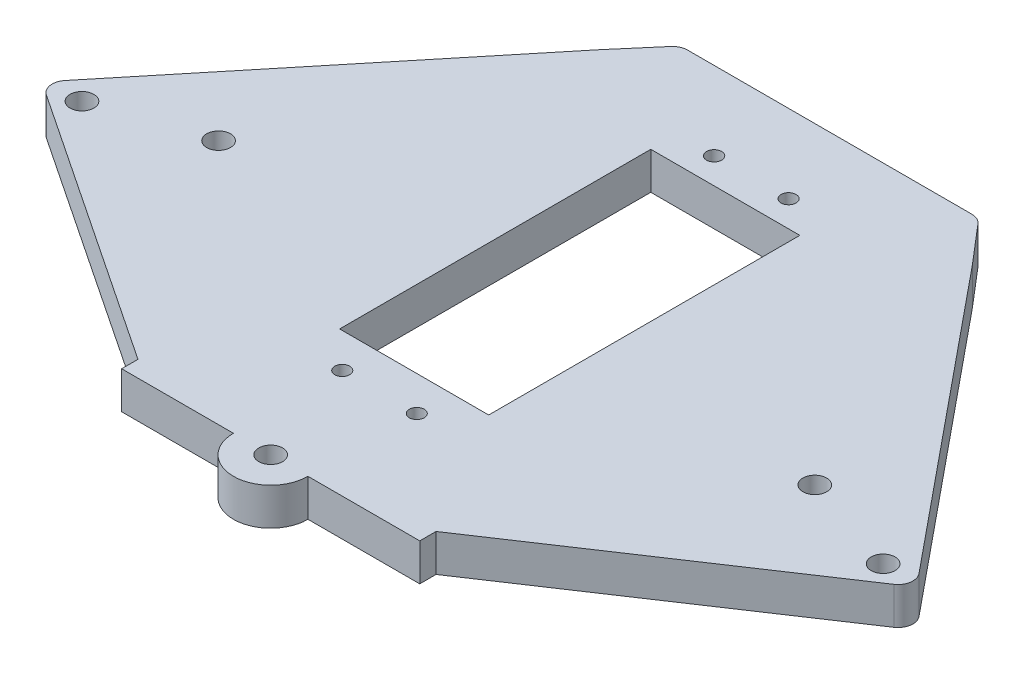
ISO-10303-21;
HEADER;
FILE_DESCRIPTION(('STEP AP214'),'2;1');
FILE_NAME('part.step','',(''),(''),'','','');
FILE_SCHEMA(('AUTOMOTIVE_DESIGN { 1 0 10303 214 1 1 1 1 }'));
ENDSEC;
DATA;
#1=APPLICATION_CONTEXT('core data for automotive mechanical design processes');
#2=APPLICATION_PROTOCOL_DEFINITION('international standard','automotive_design',2000,#1);
#3=PRODUCT_CONTEXT('',#1,'mechanical');
#4=PRODUCT('Part','Part','',(#3));
#5=PRODUCT_RELATED_PRODUCT_CATEGORY('part','',(#4));
#6=PRODUCT_DEFINITION_FORMATION('','',#4);
#7=PRODUCT_DEFINITION_CONTEXT('part definition',#1,'design');
#8=PRODUCT_DEFINITION('design','',#6,#7);
#9=PRODUCT_DEFINITION_SHAPE('','',#8);
#10=(LENGTH_UNIT() NAMED_UNIT(*) SI_UNIT(.MILLI.,.METRE.));
#11=(NAMED_UNIT(*) PLANE_ANGLE_UNIT() SI_UNIT($,.RADIAN.));
#12=(NAMED_UNIT(*) SI_UNIT($,.STERADIAN.) SOLID_ANGLE_UNIT());
#13=UNCERTAINTY_MEASURE_WITH_UNIT(LENGTH_MEASURE(1.E-05),#10,'distance_accuracy_value','');
#14=(GEOMETRIC_REPRESENTATION_CONTEXT(3) GLOBAL_UNCERTAINTY_ASSIGNED_CONTEXT((#13)) GLOBAL_UNIT_ASSIGNED_CONTEXT((#10,
#11,#12)) REPRESENTATION_CONTEXT('',''));
#15=CARTESIAN_POINT('',(0.,0.,0.));
#16=DIRECTION('',(0.,0.,1.));
#17=DIRECTION('',(1.,0.,0.));
#18=AXIS2_PLACEMENT_3D('',#15,#16,#17);
#19=CARTESIAN_POINT('',(20.,0.,10.));
#20=DIRECTION('',(1.,0.,0.));
#21=DIRECTION('',(0.,1.,0.));
#22=AXIS2_PLACEMENT_3D('',#19,#20,#21);
#23=PLANE('',#22);
#24=DIRECTION('',(0.,0.,-1.));
#25=VECTOR('',#24,1.);
#26=CARTESIAN_POINT('',(20.,0.,10.));
#27=LINE('',#26,#25);
#28=CARTESIAN_POINT('',(20.,0.,10.));
#29=VERTEX_POINT('',#28);
#30=CARTESIAN_POINT('',(20.,0.,7.81202776350934));
#31=VERTEX_POINT('',#30);
#32=EDGE_CURVE('E335',#29,#31,#27,.T.);
#33=ORIENTED_EDGE('',*,*,#32,.T.);
#34=DIRECTION('',(0.,1.,0.));
#35=VECTOR('',#34,1.);
#36=CARTESIAN_POINT('',(20.,0.,7.81202776350934));
#37=LINE('',#36,#35);
#38=CARTESIAN_POINT('',(20.,5.,7.81202776350934));
#39=VERTEX_POINT('',#38);
#40=EDGE_CURVE('E11',#31,#39,#37,.T.);
#41=ORIENTED_EDGE('',*,*,#40,.T.);
#42=DIRECTION('',(0.,0.,-1.));
#43=VECTOR('',#42,1.);
#44=CARTESIAN_POINT('',(20.,5.,10.));
#45=LINE('',#44,#43);
#46=CARTESIAN_POINT('',(20.,5.,10.));
#47=VERTEX_POINT('',#46);
#48=EDGE_CURVE('E261',#47,#39,#45,.T.);
#49=ORIENTED_EDGE('',*,*,#48,.F.);
#50=DIRECTION('',(0.,1.,0.));
#51=VECTOR('',#50,1.);
#52=CARTESIAN_POINT('',(20.,0.,10.));
#53=LINE('',#52,#51);
#54=EDGE_CURVE('E314',#29,#47,#53,.T.);
#55=ORIENTED_EDGE('',*,*,#54,.F.);
#56=EDGE_LOOP('',(#33,#41,#49,#55));
#57=FACE_BOUND('',#56,.T.);
#58=ADVANCED_FACE('F40',(#57),#23,.T.);
#59=CARTESIAN_POINT('',(20.,0.,7.81202776350934));
#60=DIRECTION('',(0.554700196225874,0.,0.832050294337414));
#61=DIRECTION('',(0.,-1.,0.));
#62=AXIS2_PLACEMENT_3D('',#59,#60,#61);
#63=PLANE('',#62);
#64=DIRECTION('',(0.832050294337414,0.,-0.554700196225874));
#65=VECTOR('',#64,1.);
#66=CARTESIAN_POINT('',(20.,0.,7.81202776350934));
#67=LINE('',#66,#65);
#68=CARTESIAN_POINT('',(56.8570140036908,0.,-16.759314905659));
#69=VERTEX_POINT('',#68);
#70=EDGE_CURVE('E364',#31,#69,#67,.T.);
#71=ORIENTED_EDGE('',*,*,#70,.T.);
#72=DIRECTION('',(0.,1.,0.));
#73=VECTOR('',#72,1.);
#74=CARTESIAN_POINT('',(56.8570140036908,0.,-16.759314905659));
#75=LINE('',#74,#73);
#76=CARTESIAN_POINT('',(56.8570140036908,5.,-16.759314905659));
#77=VERTEX_POINT('',#76);
#78=EDGE_CURVE('E48',#69,#77,#75,.T.);
#79=ORIENTED_EDGE('',*,*,#78,.T.);
#80=DIRECTION('',(0.832050294337415,0.,-0.554700196225872));
#81=VECTOR('',#80,1.);
#82=CARTESIAN_POINT('',(20.,5.,7.81202776350934));
#83=LINE('',#82,#81);
#84=EDGE_CURVE('E264',#39,#77,#83,.T.);
#85=ORIENTED_EDGE('',*,*,#84,.F.);
#86=ORIENTED_EDGE('',*,*,#40,.F.);
#87=EDGE_LOOP('',(#71,#79,#85,#86));
#88=FACE_BOUND('',#87,.T.);
#89=ADVANCED_FACE('F508',(#88),#63,.T.);
#90=CARTESIAN_POINT('',(55.7476136112391,0.,-18.4234154943338));
#91=DIRECTION('',(0.,1.,0.));
#92=DIRECTION('',(0.55470019622586,0.,0.832050294337423));
#93=AXIS2_PLACEMENT_3D('',#90,#91,#92);
#94=CYLINDRICAL_SURFACE('',#93,2.);
#95=CARTESIAN_POINT('',(55.7476136112391,0.,-18.4234154943338));
#96=DIRECTION('',(0.,1.,0.));
#97=DIRECTION('',(0.55470019622586,0.,0.832050294337423));
#98=AXIS2_PLACEMENT_3D('',#95,#96,#97);
#99=CIRCLE('',#98,2.);
#100=CARTESIAN_POINT('',(57.2953926941983,0.,-19.6900566867613));
#101=VERTEX_POINT('',#100);
#102=EDGE_CURVE('E368',#69,#101,#99,.T.);
#103=ORIENTED_EDGE('',*,*,#102,.T.);
#104=DIRECTION('',(0.,1.,0.));
#105=VECTOR('',#104,1.);
#106=CARTESIAN_POINT('',(57.2953926941983,0.,-19.6900566867613));
#107=LINE('',#106,#105);
#108=CARTESIAN_POINT('',(57.2953926941982,5.,-19.6900566867613));
#109=VERTEX_POINT('',#108);
#110=EDGE_CURVE('E316',#101,#109,#107,.T.);
#111=ORIENTED_EDGE('',*,*,#110,.T.);
#112=CARTESIAN_POINT('',(55.7476136112391,5.,-18.4234154943338));
#113=DIRECTION('',(0.,1.,0.));
#114=DIRECTION('',(0.,0.,1.));
#115=AXIS2_PLACEMENT_3D('',#112,#113,#114);
#116=CIRCLE('',#115,1.99999999999997);
#117=EDGE_CURVE('E267',#77,#109,#116,.T.);
#118=ORIENTED_EDGE('',*,*,#117,.F.);
#119=ORIENTED_EDGE('',*,*,#78,.F.);
#120=EDGE_LOOP('',(#103,#111,#118,#119));
#121=FACE_BOUND('',#120,.T.);
#122=ADVANCED_FACE('F505',(#121),#94,.T.);
#123=CARTESIAN_POINT('',(57.2953926941983,0.,-19.6900566867613));
#124=DIRECTION('',(0.77388954147282,0.,-0.633320596221999));
#125=DIRECTION('',(0.,-1.,0.));
#126=AXIS2_PLACEMENT_3D('',#123,#124,#125);
#127=PLANE('',#126);
#128=DIRECTION('',(-0.633320596221999,0.,-0.77388954147282));
#129=VECTOR('',#128,1.);
#130=CARTESIAN_POINT('',(57.2953926941982,0.,-19.6900566867613));
#131=LINE('',#130,#129);
#132=CARTESIAN_POINT('',(25.0302820040679,0.,-59.1165838935317));
#133=VERTEX_POINT('',#132);
#134=EDGE_CURVE('E362',#101,#133,#131,.T.);
#135=ORIENTED_EDGE('',*,*,#134,.T.);
#136=DIRECTION('',(0.,1.,0.));
#137=VECTOR('',#136,1.);
#138=CARTESIAN_POINT('',(25.0302820040679,0.,-59.1165838935317));
#139=LINE('',#138,#137);
#140=CARTESIAN_POINT('',(25.0302820040679,5.,-59.1165838935317));
#141=VERTEX_POINT('',#140);
#142=EDGE_CURVE('E318',#133,#141,#139,.T.);
#143=ORIENTED_EDGE('',*,*,#142,.T.);
#144=DIRECTION('',(-0.633320596222,0.,-0.773889541472819));
#145=VECTOR('',#144,1.);
#146=CARTESIAN_POINT('',(57.2953926941983,5.,-19.6900566867613));
#147=LINE('',#146,#145);
#148=EDGE_CURVE('E270',#109,#141,#147,.T.);
#149=ORIENTED_EDGE('',*,*,#148,.F.);
#150=ORIENTED_EDGE('',*,*,#110,.F.);
#151=EDGE_LOOP('',(#135,#143,#149,#150));
#152=FACE_BOUND('',#151,.T.);
#153=ADVANCED_FACE('F502',(#152),#127,.T.);
#154=CARTESIAN_POINT('',(25.0302820040679,0.,-59.1165838935317));
#155=DIRECTION('',(0.760063265775029,0.,-0.649849084033669));
#156=DIRECTION('',(0.,-1.,0.));
#157=AXIS2_PLACEMENT_3D('',#154,#155,#156);
#158=PLANE('',#157);
#159=DIRECTION('',(-0.649849084033669,0.,-0.760063265775028));
#160=VECTOR('',#159,1.);
#161=CARTESIAN_POINT('',(25.0302820040679,0.,-59.1165838935317));
#162=LINE('',#161,#160);
#163=CARTESIAN_POINT('',(20.5987534518777,0.,-64.2996981680738));
#164=VERTEX_POINT('',#163);
#165=EDGE_CURVE('E359',#133,#164,#162,.T.);
#166=ORIENTED_EDGE('',*,*,#165,.T.);
#167=DIRECTION('',(0.,1.,0.));
#168=VECTOR('',#167,1.);
#169=CARTESIAN_POINT('',(20.5987534518777,0.,-64.2996981680738));
#170=LINE('',#169,#168);
#171=CARTESIAN_POINT('',(20.5987534518777,5.,-64.2996981680738));
#172=VERTEX_POINT('',#171);
#173=EDGE_CURVE('E356',#164,#172,#170,.T.);
#174=ORIENTED_EDGE('',*,*,#173,.T.);
#175=DIRECTION('',(-0.649849084033664,0.,-0.760063265775033));
#176=VECTOR('',#175,1.);
#177=CARTESIAN_POINT('',(25.0302820040679,5.,-59.1165838935317));
#178=LINE('',#177,#176);
#179=EDGE_CURVE('E273',#141,#172,#178,.T.);
#180=ORIENTED_EDGE('',*,*,#179,.F.);
#181=ORIENTED_EDGE('',*,*,#142,.F.);
#182=EDGE_LOOP('',(#166,#174,#180,#181));
#183=FACE_BOUND('',#182,.T.);
#184=ADVANCED_FACE('F498',(#183),#158,.T.);
#185=CARTESIAN_POINT('',(19.0786269203331,0.,-63.));
#186=DIRECTION('',(0.,1.,0.));
#187=DIRECTION('',(0.760063265772275,0.,-0.64984908403689));
#188=AXIS2_PLACEMENT_3D('',#185,#186,#187);
#189=CYLINDRICAL_SURFACE('',#188,2.00000000000004);
#190=CARTESIAN_POINT('',(19.0786269203331,0.,-63.));
#191=DIRECTION('',(0.,1.,0.));
#192=DIRECTION('',(0.760063265772275,0.,-0.64984908403689));
#193=AXIS2_PLACEMENT_3D('',#190,#191,#192);
#194=CIRCLE('',#193,2.00000000000004);
#195=CARTESIAN_POINT('',(19.0786269203332,0.,-65.));
#196=VERTEX_POINT('',#195);
#197=EDGE_CURVE('E363',#164,#196,#194,.T.);
#198=ORIENTED_EDGE('',*,*,#197,.T.);
#199=DIRECTION('',(0.,1.,0.));
#200=VECTOR('',#199,1.);
#201=CARTESIAN_POINT('',(19.0786269203332,0.,-65.));
#202=LINE('',#201,#200);
#203=CARTESIAN_POINT('',(19.0786269203332,5.,-65.));
#204=VERTEX_POINT('',#203);
#205=EDGE_CURVE('E358',#196,#204,#202,.T.);
#206=ORIENTED_EDGE('',*,*,#205,.T.);
#207=CARTESIAN_POINT('',(19.0786269203331,5.,-63.));
#208=DIRECTION('',(0.,1.,0.));
#209=DIRECTION('',(0.,0.,1.));
#210=AXIS2_PLACEMENT_3D('',#207,#208,#209);
#211=CIRCLE('',#210,2.00000000000004);
#212=EDGE_CURVE('E276',#172,#204,#211,.T.);
#213=ORIENTED_EDGE('',*,*,#212,.F.);
#214=ORIENTED_EDGE('',*,*,#173,.F.);
#215=EDGE_LOOP('',(#198,#206,#213,#214));
#216=FACE_BOUND('',#215,.T.);
#217=ADVANCED_FACE('F494',(#216),#189,.T.);
#218=CARTESIAN_POINT('',(19.0786269203332,0.,-65.));
#219=DIRECTION('',(0.,0.,-1.));
#220=DIRECTION('',(0.,-1.,0.));
#221=AXIS2_PLACEMENT_3D('',#218,#219,#220);
#222=PLANE('',#221);
#223=DIRECTION('',(-1.,0.,0.));
#224=VECTOR('',#223,1.);
#225=CARTESIAN_POINT('',(19.0786269203332,0.,-65.));
#226=LINE('',#225,#224);
#227=CARTESIAN_POINT('',(-19.0786269203332,0.,-65.));
#228=VERTEX_POINT('',#227);
#229=EDGE_CURVE('E310',#196,#228,#226,.T.);
#230=ORIENTED_EDGE('',*,*,#229,.T.);
#231=DIRECTION('',(0.,1.,0.));
#232=VECTOR('',#231,1.);
#233=CARTESIAN_POINT('',(-19.0786269203332,0.,-65.));
#234=LINE('',#233,#232);
#235=CARTESIAN_POINT('',(-19.0786269203332,5.,-65.));
#236=VERTEX_POINT('',#235);
#237=EDGE_CURVE('E321',#228,#236,#234,.T.);
#238=ORIENTED_EDGE('',*,*,#237,.T.);
#239=DIRECTION('',(-1.,0.,0.));
#240=VECTOR('',#239,1.);
#241=CARTESIAN_POINT('',(19.0786269203332,5.,-65.));
#242=LINE('',#241,#240);
#243=EDGE_CURVE('E279',#204,#236,#242,.T.);
#244=ORIENTED_EDGE('',*,*,#243,.F.);
#245=ORIENTED_EDGE('',*,*,#205,.F.);
#246=EDGE_LOOP('',(#230,#238,#244,#245));
#247=FACE_BOUND('',#246,.T.);
#248=ADVANCED_FACE('F491',(#247),#222,.T.);
#249=CARTESIAN_POINT('',(-19.0786269203332,0.,-63.));
#250=DIRECTION('',(0.,1.,0.));
#251=DIRECTION('',(0.,0.,-1.));
#252=AXIS2_PLACEMENT_3D('',#249,#250,#251);
#253=CYLINDRICAL_SURFACE('',#252,1.99999999999996);
#254=CARTESIAN_POINT('',(-19.0786269203332,0.,-63.));
#255=DIRECTION('',(0.,1.,0.));
#256=DIRECTION('',(0.,0.,-1.));
#257=AXIS2_PLACEMENT_3D('',#254,#255,#256);
#258=CIRCLE('',#257,1.99999999999996);
#259=CARTESIAN_POINT('',(-20.5987534518777,0.,-64.2996981680738));
#260=VERTEX_POINT('',#259);
#261=EDGE_CURVE('E307',#228,#260,#258,.T.);
#262=ORIENTED_EDGE('',*,*,#261,.T.);
#263=DIRECTION('',(0.,1.,0.));
#264=VECTOR('',#263,1.);
#265=CARTESIAN_POINT('',(-20.5987534518777,0.,-64.2996981680738));
#266=LINE('',#265,#264);
#267=CARTESIAN_POINT('',(-20.5987534518777,5.,-64.2996981680738));
#268=VERTEX_POINT('',#267);
#269=EDGE_CURVE('E319',#260,#268,#266,.T.);
#270=ORIENTED_EDGE('',*,*,#269,.T.);
#271=CARTESIAN_POINT('',(-19.0786269203332,5.,-63.));
#272=DIRECTION('',(0.,1.,0.));
#273=DIRECTION('',(0.,0.,1.));
#274=AXIS2_PLACEMENT_3D('',#271,#272,#273);
#275=CIRCLE('',#274,1.99999999999999);
#276=EDGE_CURVE('E282',#236,#268,#275,.T.);
#277=ORIENTED_EDGE('',*,*,#276,.F.);
#278=ORIENTED_EDGE('',*,*,#237,.F.);
#279=EDGE_LOOP('',(#262,#270,#277,#278));
#280=FACE_BOUND('',#279,.T.);
#281=ADVANCED_FACE('F487',(#280),#253,.T.);
#282=CARTESIAN_POINT('',(-20.5987534518777,0.,-64.2996981680738));
#283=DIRECTION('',(-0.760063265775028,0.,-0.649849084033669));
#284=DIRECTION('',(-0.649849084033669,0.,0.760063265775028));
#285=AXIS2_PLACEMENT_3D('',#282,#283,#284);
#286=PLANE('',#285);
#287=DIRECTION('',(-0.649849084033669,0.,0.760063265775028));
#288=VECTOR('',#287,1.);
#289=CARTESIAN_POINT('',(-20.5987534518777,0.,-64.2996981680738));
#290=LINE('',#289,#288);
#291=CARTESIAN_POINT('',(-25.030282004068,0.,-59.1165838935317));
#292=VERTEX_POINT('',#291);
#293=EDGE_CURVE('E311',#260,#292,#290,.T.);
#294=ORIENTED_EDGE('',*,*,#293,.T.);
#295=DIRECTION('',(0.,1.,0.));
#296=VECTOR('',#295,1.);
#297=CARTESIAN_POINT('',(-25.030282004068,0.,-59.1165838935317));
#298=LINE('',#297,#296);
#299=CARTESIAN_POINT('',(-25.030282004068,5.,-59.1165838935317));
#300=VERTEX_POINT('',#299);
#301=EDGE_CURVE('E322',#292,#300,#298,.T.);
#302=ORIENTED_EDGE('',*,*,#301,.T.);
#303=DIRECTION('',(-0.64984908403367,0.,0.760063265775027));
#304=VECTOR('',#303,1.);
#305=CARTESIAN_POINT('',(-20.5987534518777,5.,-64.2996981680738));
#306=LINE('',#305,#304);
#307=EDGE_CURVE('E285',#268,#300,#306,.T.);
#308=ORIENTED_EDGE('',*,*,#307,.F.);
#309=ORIENTED_EDGE('',*,*,#269,.F.);
#310=EDGE_LOOP('',(#294,#302,#308,#309));
#311=FACE_BOUND('',#310,.T.);
#312=ADVANCED_FACE('F482',(#311),#286,.T.);
#313=CARTESIAN_POINT('',(-25.030282004068,0.,-59.1165838935317));
#314=DIRECTION('',(-0.77388954147282,0.,-0.633320596221999));
#315=DIRECTION('',(-0.633320596221999,0.,0.77388954147282));
#316=AXIS2_PLACEMENT_3D('',#313,#314,#315);
#317=PLANE('',#316);
#318=DIRECTION('',(-0.633320596221999,0.,0.77388954147282));
#319=VECTOR('',#318,1.);
#320=CARTESIAN_POINT('',(-25.030282004068,0.,-59.1165838935317));
#321=LINE('',#320,#319);
#322=CARTESIAN_POINT('',(-57.2953926941983,0.,-19.6900566867613));
#323=VERTEX_POINT('',#322);
#324=EDGE_CURVE('E336',#292,#323,#321,.T.);
#325=ORIENTED_EDGE('',*,*,#324,.T.);
#326=DIRECTION('',(0.,1.,0.));
#327=VECTOR('',#326,1.);
#328=CARTESIAN_POINT('',(-57.2953926941983,0.,-19.6900566867613));
#329=LINE('',#328,#327);
#330=CARTESIAN_POINT('',(-57.2953926941983,5.,-19.6900566867613));
#331=VERTEX_POINT('',#330);
#332=EDGE_CURVE('E330',#323,#331,#329,.T.);
#333=ORIENTED_EDGE('',*,*,#332,.T.);
#334=DIRECTION('',(-0.633320596221999,0.,0.77388954147282));
#335=VECTOR('',#334,1.);
#336=CARTESIAN_POINT('',(-25.030282004068,5.,-59.1165838935317));
#337=LINE('',#336,#335);
#338=EDGE_CURVE('E288',#300,#331,#337,.T.);
#339=ORIENTED_EDGE('',*,*,#338,.F.);
#340=ORIENTED_EDGE('',*,*,#301,.F.);
#341=EDGE_LOOP('',(#325,#333,#339,#340));
#342=FACE_BOUND('',#341,.T.);
#343=ADVANCED_FACE('F479',(#342),#317,.T.);
#344=CARTESIAN_POINT('',(-55.7476136112391,0.,-18.4234154943338));
#345=DIRECTION('',(0.,1.,0.));
#346=DIRECTION('',(-0.773889541479576,0.,-0.633320596213743));
#347=AXIS2_PLACEMENT_3D('',#344,#345,#346);
#348=CYLINDRICAL_SURFACE('',#347,2.);
#349=CARTESIAN_POINT('',(-55.7476136112391,0.,-18.4234154943338));
#350=DIRECTION('',(0.,1.,0.));
#351=DIRECTION('',(-0.773889541479576,0.,-0.633320596213743));
#352=AXIS2_PLACEMENT_3D('',#349,#350,#351);
#353=CIRCLE('',#352,2.);
#354=CARTESIAN_POINT('',(-56.8570140036908,0.,-16.759314905659));
#355=VERTEX_POINT('',#354);
#356=EDGE_CURVE('E339',#323,#355,#353,.T.);
#357=ORIENTED_EDGE('',*,*,#356,.T.);
#358=DIRECTION('',(0.,1.,0.));
#359=VECTOR('',#358,1.);
#360=CARTESIAN_POINT('',(-56.8570140036908,0.,-16.759314905659));
#361=LINE('',#360,#359);
#362=CARTESIAN_POINT('',(-56.8570140036908,5.,-16.7593149056589));
#363=VERTEX_POINT('',#362);
#364=EDGE_CURVE('E369',#355,#363,#361,.T.);
#365=ORIENTED_EDGE('',*,*,#364,.T.);
#366=CARTESIAN_POINT('',(-55.7476136112391,5.,-18.4234154943338));
#367=DIRECTION('',(0.,1.,0.));
#368=DIRECTION('',(0.,0.,1.));
#369=AXIS2_PLACEMENT_3D('',#366,#367,#368);
#370=CIRCLE('',#369,2.00000000000002);
#371=EDGE_CURVE('E291',#331,#363,#370,.T.);
#372=ORIENTED_EDGE('',*,*,#371,.F.);
#373=ORIENTED_EDGE('',*,*,#332,.F.);
#374=EDGE_LOOP('',(#357,#365,#372,#373));
#375=FACE_BOUND('',#374,.T.);
#376=ADVANCED_FACE('F475',(#375),#348,.T.);
#377=CARTESIAN_POINT('',(-56.8570140036908,0.,-16.759314905659));
#378=DIRECTION('',(-0.554700196225872,0.,0.832050294337415));
#379=DIRECTION('',(0.,1.,0.));
#380=AXIS2_PLACEMENT_3D('',#377,#378,#379);
#381=PLANE('',#380);
#382=DIRECTION('',(0.832050294337415,0.,0.554700196225872));
#383=VECTOR('',#382,1.);
#384=CARTESIAN_POINT('',(-56.8570140036908,0.,-16.759314905659));
#385=LINE('',#384,#383);
#386=CARTESIAN_POINT('',(-20.,0.,7.81202776350934));
#387=VERTEX_POINT('',#386);
#388=EDGE_CURVE('E379',#355,#387,#385,.T.);
#389=ORIENTED_EDGE('',*,*,#388,.T.);
#390=DIRECTION('',(0.,1.,0.));
#391=VECTOR('',#390,1.);
#392=CARTESIAN_POINT('',(-20.,0.,7.81202776350934));
#393=LINE('',#392,#391);
#394=CARTESIAN_POINT('',(-20.,5.,7.81202776350934));
#395=VERTEX_POINT('',#394);
#396=EDGE_CURVE('E328',#387,#395,#393,.T.);
#397=ORIENTED_EDGE('',*,*,#396,.T.);
#398=DIRECTION('',(0.832050294337416,0.,0.554700196225871));
#399=VECTOR('',#398,1.);
#400=CARTESIAN_POINT('',(-56.8570140036908,5.,-16.759314905659));
#401=LINE('',#400,#399);
#402=EDGE_CURVE('E294',#363,#395,#401,.T.);
#403=ORIENTED_EDGE('',*,*,#402,.F.);
#404=ORIENTED_EDGE('',*,*,#364,.F.);
#405=EDGE_LOOP('',(#389,#397,#403,#404));
#406=FACE_BOUND('',#405,.T.);
#407=ADVANCED_FACE('F470',(#406),#381,.T.);
#408=CARTESIAN_POINT('',(-20.,0.,7.81202776350934));
#409=DIRECTION('',(-1.,0.,0.));
#410=DIRECTION('',(0.,0.,1.));
#411=AXIS2_PLACEMENT_3D('',#408,#409,#410);
#412=PLANE('',#411);
#413=DIRECTION('',(0.,0.,1.));
#414=VECTOR('',#413,1.);
#415=CARTESIAN_POINT('',(-20.,0.,7.81202776350934));
#416=LINE('',#415,#414);
#417=CARTESIAN_POINT('',(-20.,0.,10.));
#418=VERTEX_POINT('',#417);
#419=EDGE_CURVE('E412',#387,#418,#416,.T.);
#420=ORIENTED_EDGE('',*,*,#419,.T.);
#421=DIRECTION('',(0.,1.,0.));
#422=VECTOR('',#421,1.);
#423=CARTESIAN_POINT('',(-20.,0.,10.));
#424=LINE('',#423,#422);
#425=CARTESIAN_POINT('',(-20.,5.,10.));
#426=VERTEX_POINT('',#425);
#427=EDGE_CURVE('E326',#418,#426,#424,.T.);
#428=ORIENTED_EDGE('',*,*,#427,.T.);
#429=DIRECTION('',(0.,0.,1.));
#430=VECTOR('',#429,1.);
#431=CARTESIAN_POINT('',(-20.,5.,7.81202776350934));
#432=LINE('',#431,#430);
#433=EDGE_CURVE('E297',#395,#426,#432,.T.);
#434=ORIENTED_EDGE('',*,*,#433,.F.);
#435=ORIENTED_EDGE('',*,*,#396,.F.);
#436=EDGE_LOOP('',(#420,#428,#434,#435));
#437=FACE_BOUND('',#436,.T.);
#438=ADVANCED_FACE('F467',(#437),#412,.T.);
#439=CARTESIAN_POINT('',(-20.,0.,10.));
#440=DIRECTION('',(0.,0.,1.));
#441=DIRECTION('',(1.,0.,0.));
#442=AXIS2_PLACEMENT_3D('',#439,#440,#441);
#443=PLANE('',#442);
#444=DIRECTION('',(1.,0.,0.));
#445=VECTOR('',#444,1.);
#446=CARTESIAN_POINT('',(-20.,0.,10.));
#447=LINE('',#446,#445);
#448=CARTESIAN_POINT('',(-5.,0.,10.));
#449=VERTEX_POINT('',#448);
#450=EDGE_CURVE('E355',#418,#449,#447,.T.);
#451=ORIENTED_EDGE('',*,*,#450,.T.);
#452=DIRECTION('',(0.,1.,0.));
#453=VECTOR('',#452,1.);
#454=CARTESIAN_POINT('',(-5.,0.,10.));
#455=LINE('',#454,#453);
#456=CARTESIAN_POINT('',(-5.,5.,10.));
#457=VERTEX_POINT('',#456);
#458=EDGE_CURVE('E325',#449,#457,#455,.T.);
#459=ORIENTED_EDGE('',*,*,#458,.T.);
#460=DIRECTION('',(1.,0.,0.));
#461=VECTOR('',#460,1.);
#462=CARTESIAN_POINT('',(-20.,5.,10.));
#463=LINE('',#462,#461);
#464=EDGE_CURVE('E300',#426,#457,#463,.T.);
#465=ORIENTED_EDGE('',*,*,#464,.F.);
#466=ORIENTED_EDGE('',*,*,#427,.F.);
#467=EDGE_LOOP('',(#451,#459,#465,#466));
#468=FACE_BOUND('',#467,.T.);
#469=ADVANCED_FACE('F463',(#468),#443,.T.);
#470=CARTESIAN_POINT('',(0.,0.,10.));
#471=DIRECTION('',(0.,1.,0.));
#472=DIRECTION('',(-1.,0.,0.));
#473=AXIS2_PLACEMENT_3D('',#470,#471,#472);
#474=CYLINDRICAL_SURFACE('',#473,5.);
#475=CARTESIAN_POINT('',(0.,0.,10.));
#476=DIRECTION('',(0.,1.,0.));
#477=DIRECTION('',(-1.,0.,0.));
#478=AXIS2_PLACEMENT_3D('',#475,#476,#477);
#479=CIRCLE('',#478,5.);
#480=CARTESIAN_POINT('',(5.,0.,10.));
#481=VERTEX_POINT('',#480);
#482=EDGE_CURVE('E334',#449,#481,#479,.T.);
#483=ORIENTED_EDGE('',*,*,#482,.T.);
#484=DIRECTION('',(0.,1.,0.));
#485=VECTOR('',#484,1.);
#486=CARTESIAN_POINT('',(5.,0.,10.));
#487=LINE('',#486,#485);
#488=CARTESIAN_POINT('',(5.,5.,10.));
#489=VERTEX_POINT('',#488);
#490=EDGE_CURVE('E323',#481,#489,#487,.T.);
#491=ORIENTED_EDGE('',*,*,#490,.T.);
#492=CARTESIAN_POINT('',(0.,5.,10.));
#493=DIRECTION('',(0.,1.,0.));
#494=DIRECTION('',(0.,0.,1.));
#495=AXIS2_PLACEMENT_3D('',#492,#493,#494);
#496=CIRCLE('',#495,5.);
#497=EDGE_CURVE('E303',#457,#489,#496,.T.);
#498=ORIENTED_EDGE('',*,*,#497,.F.);
#499=ORIENTED_EDGE('',*,*,#458,.F.);
#500=EDGE_LOOP('',(#483,#491,#498,#499));
#501=FACE_BOUND('',#500,.T.);
#502=ADVANCED_FACE('F458',(#501),#474,.T.);
#503=CARTESIAN_POINT('',(5.,0.,10.));
#504=DIRECTION('',(0.,0.,1.));
#505=DIRECTION('',(1.,0.,0.));
#506=AXIS2_PLACEMENT_3D('',#503,#504,#505);
#507=PLANE('',#506);
#508=DIRECTION('',(1.,0.,0.));
#509=VECTOR('',#508,1.);
#510=CARTESIAN_POINT('',(5.,0.,10.));
#511=LINE('',#510,#509);
#512=EDGE_CURVE('E331',#481,#29,#511,.T.);
#513=ORIENTED_EDGE('',*,*,#512,.T.);
#514=ORIENTED_EDGE('',*,*,#54,.T.);
#515=DIRECTION('',(1.,0.,0.));
#516=VECTOR('',#515,1.);
#517=CARTESIAN_POINT('',(5.,5.,10.));
#518=LINE('',#517,#516);
#519=EDGE_CURVE('E255',#489,#47,#518,.T.);
#520=ORIENTED_EDGE('',*,*,#519,.F.);
#521=ORIENTED_EDGE('',*,*,#490,.F.);
#522=EDGE_LOOP('',(#513,#514,#520,#521));
#523=FACE_BOUND('',#522,.T.);
#524=ADVANCED_FACE('F455',(#523),#507,.T.);
#525=CARTESIAN_POINT('',(10.,0.,-55.));
#526=DIRECTION('',(-1.,0.,0.));
#527=DIRECTION('',(0.,0.,1.));
#528=AXIS2_PLACEMENT_3D('',#525,#526,#527);
#529=PLANE('',#528);
#530=DIRECTION('',(0.,1.,0.));
#531=VECTOR('',#530,1.);
#532=CARTESIAN_POINT('',(10.0000001490116,0.,-9.25000011920937));
#533=LINE('',#532,#531);
#534=CARTESIAN_POINT('',(10.,0.,-9.25000011920937));
#535=VERTEX_POINT('',#534);
#536=CARTESIAN_POINT('',(10.0000001446799,5.,-9.25000011920937));
#537=VERTEX_POINT('',#536);
#538=EDGE_CURVE('E233',#535,#537,#533,.T.);
#539=ORIENTED_EDGE('',*,*,#538,.T.);
#540=DIRECTION('',(-3.46538599334289E-09,0.,-1.));
#541=VECTOR('',#540,1.);
#542=CARTESIAN_POINT('',(10.,5.,-51.0000007599593));
#543=LINE('',#542,#541);
#544=CARTESIAN_POINT('',(10.,5.,-51.0000007599593));
#545=VERTEX_POINT('',#544);
#546=EDGE_CURVE('E228',#537,#545,#543,.T.);
#547=ORIENTED_EDGE('',*,*,#546,.T.);
#548=DIRECTION('',(0.,-1.,0.));
#549=VECTOR('',#548,1.);
#550=CARTESIAN_POINT('',(10.,2.,-51.0000007599593));
#551=LINE('',#550,#549);
#552=CARTESIAN_POINT('',(10.,0.,-51.0000007599593));
#553=VERTEX_POINT('',#552);
#554=EDGE_CURVE('E231',#545,#553,#551,.T.);
#555=ORIENTED_EDGE('',*,*,#554,.T.);
#556=DIRECTION('',(0.,0.,1.));
#557=VECTOR('',#556,1.);
#558=CARTESIAN_POINT('',(10.,0.,-55.));
#559=LINE('',#558,#557);
#560=EDGE_CURVE('E55',#553,#535,#559,.T.);
#561=ORIENTED_EDGE('',*,*,#560,.T.);
#562=EDGE_LOOP('',(#539,#547,#555,#561));
#563=FACE_BOUND('',#562,.T.);
#564=ADVANCED_FACE('F230',(#563),#529,.T.);
#565=CARTESIAN_POINT('',(40.,0.,-23.0064991159576));
#566=DIRECTION('',(0.,1.,0.));
#567=DIRECTION('',(1.,0.,0.));
#568=AXIS2_PLACEMENT_3D('',#565,#566,#567);
#569=CYLINDRICAL_SURFACE('',#568,1.6);
#570=CARTESIAN_POINT('',(40.,0.,-23.0064991159576));
#571=DIRECTION('',(0.,-1.,0.));
#572=DIRECTION('',(1.,0.,0.));
#573=AXIS2_PLACEMENT_3D('',#570,#571,#572);
#574=CIRCLE('',#573,1.6);
#575=CARTESIAN_POINT('',(38.4,0.,-23.0064991159576));
#576=VERTEX_POINT('',#575);
#577=EDGE_CURVE('E376',#576,#576,#574,.T.);
#578=ORIENTED_EDGE('',*,*,#577,.T.);
#579=DIRECTION('',(0.,1.,0.));
#580=VECTOR('',#579,1.);
#581=CARTESIAN_POINT('',(38.4,0.,-23.0064991159576));
#582=LINE('',#581,#580);
#583=CARTESIAN_POINT('',(38.4,4.,-23.0064991159576));
#584=VERTEX_POINT('',#583);
#585=EDGE_CURVE('E312',#576,#584,#582,.T.);
#586=ORIENTED_EDGE('',*,*,#585,.T.);
#587=ORIENTED_EDGE('',*,*,#585,.F.);
#588=EDGE_LOOP('',(#578,#586,#587));
#589=FACE_BOUND('',#588,.T.);
#590=CARTESIAN_POINT('',(40.,5.,-23.0064991159576));
#591=DIRECTION('',(0.,1.,0.));
#592=DIRECTION('',(0.,0.,1.));
#593=AXIS2_PLACEMENT_3D('',#590,#591,#592);
#594=CIRCLE('',#593,1.6);
#595=CARTESIAN_POINT('',(40.,5.,-21.4064991159576));
#596=VERTEX_POINT('',#595);
#597=EDGE_CURVE('E525',#596,#596,#594,.T.);
#598=ORIENTED_EDGE('',*,*,#597,.T.);
#599=EDGE_LOOP('',(#598));
#600=FACE_BOUND('',#599,.T.);
#601=ADVANCED_FACE('F581',(#589,#600),#569,.F.);
#602=CARTESIAN_POINT('',(-40.,0.,-23.0064991159576));
#603=DIRECTION('',(0.,1.,0.));
#604=DIRECTION('',(1.,0.,0.));
#605=AXIS2_PLACEMENT_3D('',#602,#603,#604);
#606=CYLINDRICAL_SURFACE('',#605,1.6);
#607=CARTESIAN_POINT('',(-40.,0.,-23.0064991159576));
#608=DIRECTION('',(0.,-1.,0.));
#609=DIRECTION('',(1.,0.,0.));
#610=AXIS2_PLACEMENT_3D('',#607,#608,#609);
#611=CIRCLE('',#610,1.6);
#612=CARTESIAN_POINT('',(-41.6,0.,-23.0064991159576));
#613=VERTEX_POINT('',#612);
#614=EDGE_CURVE('E381',#613,#613,#611,.T.);
#615=ORIENTED_EDGE('',*,*,#614,.T.);
#616=DIRECTION('',(0.,1.,0.));
#617=VECTOR('',#616,1.);
#618=CARTESIAN_POINT('',(-41.6,0.,-23.0064991159576));
#619=LINE('',#618,#617);
#620=CARTESIAN_POINT('',(-41.6,4.,-23.0064991159576));
#621=VERTEX_POINT('',#620);
#622=EDGE_CURVE('E315',#613,#621,#619,.T.);
#623=ORIENTED_EDGE('',*,*,#622,.T.);
#624=ORIENTED_EDGE('',*,*,#622,.F.);
#625=EDGE_LOOP('',(#615,#623,#624));
#626=FACE_BOUND('',#625,.T.);
#627=CARTESIAN_POINT('',(-40.,5.,-23.0064991159576));
#628=DIRECTION('',(0.,1.,0.));
#629=DIRECTION('',(0.,0.,1.));
#630=AXIS2_PLACEMENT_3D('',#627,#628,#629);
#631=CIRCLE('',#630,1.6);
#632=CARTESIAN_POINT('',(-40.,5.,-21.4064991159576));
#633=VERTEX_POINT('',#632);
#634=EDGE_CURVE('E532',#633,#633,#631,.T.);
#635=ORIENTED_EDGE('',*,*,#634,.T.);
#636=EDGE_LOOP('',(#635));
#637=FACE_BOUND('',#636,.T.);
#638=ADVANCED_FACE('F578',(#626,#637),#606,.F.);
#639=CARTESIAN_POINT('',(-53.7476136112391,0.,-18.4234154943338));
#640=DIRECTION('',(0.,1.,0.));
#641=DIRECTION('',(-1.,0.,0.));
#642=AXIS2_PLACEMENT_3D('',#639,#640,#641);
#643=CYLINDRICAL_SURFACE('',#642,1.6);
#644=CARTESIAN_POINT('',(-53.7476136112391,0.,-18.4234154943338));
#645=DIRECTION('',(0.,1.,0.));
#646=DIRECTION('',(-1.,0.,0.));
#647=AXIS2_PLACEMENT_3D('',#644,#645,#646);
#648=CIRCLE('',#647,1.6);
#649=CARTESIAN_POINT('',(-52.1476136112391,0.,-18.4234154943338));
#650=VERTEX_POINT('',#649);
#651=EDGE_CURVE('E377',#650,#650,#648,.T.);
#652=ORIENTED_EDGE('',*,*,#651,.F.);
#653=DIRECTION('',(0.,1.,0.));
#654=VECTOR('',#653,1.);
#655=CARTESIAN_POINT('',(-52.1476136112391,0.,-18.4234154943338));
#656=LINE('',#655,#654);
#657=CARTESIAN_POINT('',(-52.1476136112391,4.,-18.4234154943338));
#658=VERTEX_POINT('',#657);
#659=EDGE_CURVE('E393',#650,#658,#656,.T.);
#660=ORIENTED_EDGE('',*,*,#659,.T.);
#661=ORIENTED_EDGE('',*,*,#659,.F.);
#662=EDGE_LOOP('',(#652,#660,#661));
#663=FACE_BOUND('',#662,.T.);
#664=CARTESIAN_POINT('',(-53.7476136112391,5.,-18.4234154943338));
#665=DIRECTION('',(0.,1.,0.));
#666=DIRECTION('',(0.,0.,1.));
#667=AXIS2_PLACEMENT_3D('',#664,#665,#666);
#668=CIRCLE('',#667,1.6);
#669=CARTESIAN_POINT('',(-53.7476136112391,5.,-16.8234154943338));
#670=VERTEX_POINT('',#669);
#671=EDGE_CURVE('E542',#670,#670,#668,.T.);
#672=ORIENTED_EDGE('',*,*,#671,.T.);
#673=EDGE_LOOP('',(#672));
#674=FACE_BOUND('',#673,.T.);
#675=ADVANCED_FACE('F42',(#663,#674),#643,.F.);
#676=CARTESIAN_POINT('',(53.7476136112391,0.,-18.4234154943338));
#677=DIRECTION('',(0.,1.,0.));
#678=DIRECTION('',(-1.,0.,0.));
#679=AXIS2_PLACEMENT_3D('',#676,#677,#678);
#680=CYLINDRICAL_SURFACE('',#679,1.6);
#681=CARTESIAN_POINT('',(53.7476136112391,0.,-18.4234154943338));
#682=DIRECTION('',(0.,1.,0.));
#683=DIRECTION('',(-1.,0.,0.));
#684=AXIS2_PLACEMENT_3D('',#681,#682,#683);
#685=CIRCLE('',#684,1.6);
#686=CARTESIAN_POINT('',(55.3476136112391,0.,-18.4234154943338));
#687=VERTEX_POINT('',#686);
#688=EDGE_CURVE('E352',#687,#687,#685,.T.);
#689=ORIENTED_EDGE('',*,*,#688,.F.);
#690=DIRECTION('',(0.,1.,0.));
#691=VECTOR('',#690,1.);
#692=CARTESIAN_POINT('',(55.3476136112391,0.,-18.4234154943338));
#693=LINE('',#692,#691);
#694=CARTESIAN_POINT('',(55.3476136112391,4.,-18.4234154943338));
#695=VERTEX_POINT('',#694);
#696=EDGE_CURVE('E391',#687,#695,#693,.T.);
#697=ORIENTED_EDGE('',*,*,#696,.T.);
#698=ORIENTED_EDGE('',*,*,#696,.F.);
#699=EDGE_LOOP('',(#689,#697,#698));
#700=FACE_BOUND('',#699,.T.);
#701=CARTESIAN_POINT('',(53.7476136112391,5.,-18.4234154943338));
#702=DIRECTION('',(0.,1.,0.));
#703=DIRECTION('',(0.,0.,1.));
#704=AXIS2_PLACEMENT_3D('',#701,#702,#703);
#705=CIRCLE('',#704,1.6);
#706=CARTESIAN_POINT('',(53.7476136112391,5.,-16.8234154943338));
#707=VERTEX_POINT('',#706);
#708=EDGE_CURVE('E546',#707,#707,#705,.T.);
#709=ORIENTED_EDGE('',*,*,#708,.T.);
#710=EDGE_LOOP('',(#709));
#711=FACE_BOUND('',#710,.T.);
#712=ADVANCED_FACE('F555',(#700,#711),#680,.F.);
#713=CARTESIAN_POINT('',(0.,0.,10.));
#714=DIRECTION('',(0.,1.,0.));
#715=DIRECTION('',(-1.,0.,0.));
#716=AXIS2_PLACEMENT_3D('',#713,#714,#715);
#717=CYLINDRICAL_SURFACE('',#716,1.6);
#718=CARTESIAN_POINT('',(0.,0.,10.));
#719=DIRECTION('',(0.,1.,0.));
#720=DIRECTION('',(-1.,0.,0.));
#721=AXIS2_PLACEMENT_3D('',#718,#719,#720);
#722=CIRCLE('',#721,1.6);
#723=CARTESIAN_POINT('',(1.6,0.,10.));
#724=VERTEX_POINT('',#723);
#725=EDGE_CURVE('E344',#724,#724,#722,.T.);
#726=ORIENTED_EDGE('',*,*,#725,.F.);
#727=DIRECTION('',(0.,1.,0.));
#728=VECTOR('',#727,1.);
#729=CARTESIAN_POINT('',(1.6,0.,10.));
#730=LINE('',#729,#728);
#731=CARTESIAN_POINT('',(1.6,4.,10.));
#732=VERTEX_POINT('',#731);
#733=EDGE_CURVE('E248',#724,#732,#730,.T.);
#734=ORIENTED_EDGE('',*,*,#733,.T.);
#735=ORIENTED_EDGE('',*,*,#733,.F.);
#736=EDGE_LOOP('',(#726,#734,#735));
#737=FACE_BOUND('',#736,.T.);
#738=CARTESIAN_POINT('',(0.,5.,10.));
#739=DIRECTION('',(0.,1.,0.));
#740=DIRECTION('',(0.,0.,1.));
#741=AXIS2_PLACEMENT_3D('',#738,#739,#740);
#742=CIRCLE('',#741,1.6);
#743=CARTESIAN_POINT('',(0.,5.,11.6));
#744=VERTEX_POINT('',#743);
#745=EDGE_CURVE('E239',#744,#744,#742,.T.);
#746=ORIENTED_EDGE('',*,*,#745,.T.);
#747=EDGE_LOOP('',(#746));
#748=FACE_BOUND('',#747,.T.);
#749=ADVANCED_FACE('F553',(#737,#748),#717,.F.);
#750=CARTESIAN_POINT('',(10.,4.,-51.0000007599593));
#751=DIRECTION('',(0.,0.,1.));
#752=DIRECTION('',(0.,-1.,0.));
#753=AXIS2_PLACEMENT_3D('',#750,#751,#752);
#754=PLANE('',#753);
#755=ORIENTED_EDGE('',*,*,#554,.F.);
#756=DIRECTION('',(-1.,0.,0.));
#757=VECTOR('',#756,1.);
#758=CARTESIAN_POINT('',(-10.0000001490116,5.,-51.0000007599593));
#759=LINE('',#758,#757);
#760=CARTESIAN_POINT('',(-10.0000001490116,5.,-51.0000007599593));
#761=VERTEX_POINT('',#760);
#762=EDGE_CURVE('E238',#545,#761,#759,.T.);
#763=ORIENTED_EDGE('',*,*,#762,.T.);
#764=DIRECTION('',(0.,1.,0.));
#765=VECTOR('',#764,1.);
#766=CARTESIAN_POINT('',(-10.,1.99999999999996,-51.0000007599593));
#767=LINE('',#766,#765);
#768=CARTESIAN_POINT('',(-10.0000001490116,0.,-51.0000007599593));
#769=VERTEX_POINT('',#768);
#770=EDGE_CURVE('E340',#769,#761,#767,.T.);
#771=ORIENTED_EDGE('',*,*,#770,.F.);
#772=DIRECTION('',(-1.,0.,0.));
#773=VECTOR('',#772,1.);
#774=CARTESIAN_POINT('',(-10.0000001490116,0.,-51.0000007599593));
#775=LINE('',#774,#773);
#776=EDGE_CURVE('E247',#553,#769,#775,.T.);
#777=ORIENTED_EDGE('',*,*,#776,.F.);
#778=EDGE_LOOP('',(#755,#763,#771,#777));
#779=FACE_BOUND('',#778,.T.);
#780=ADVANCED_FACE('F243',(#779),#754,.T.);
#781=CARTESIAN_POINT('',(-4.99920508079469,4.,-54.4907450548567));
#782=DIRECTION('',(0.,-1.,0.));
#783=DIRECTION('',(-1.,0.,0.));
#784=AXIS2_PLACEMENT_3D('',#781,#782,#783);
#785=CYLINDRICAL_SURFACE('',#784,1.01391318717737);
#786=CARTESIAN_POINT('',(-4.99920508079469,0.,-54.4907450548567));
#787=DIRECTION('',(0.,1.,0.));
#788=DIRECTION('',(-1.,0.,0.));
#789=AXIS2_PLACEMENT_3D('',#786,#787,#788);
#790=CIRCLE('',#789,1.01391318717737);
#791=CARTESIAN_POINT('',(-3.98529189361733,0.,-54.4907450548567));
#792=VERTEX_POINT('',#791);
#793=EDGE_CURVE('E367',#792,#792,#790,.T.);
#794=ORIENTED_EDGE('',*,*,#793,.F.);
#795=DIRECTION('',(0.,1.,0.));
#796=VECTOR('',#795,1.);
#797=CARTESIAN_POINT('',(-3.98529189361733,4.,-54.4907450548567));
#798=LINE('',#797,#796);
#799=CARTESIAN_POINT('',(-3.98529189361733,4.,-54.4907450548567));
#800=VERTEX_POINT('',#799);
#801=EDGE_CURVE('E249',#792,#800,#798,.T.);
#802=ORIENTED_EDGE('',*,*,#801,.T.);
#803=ORIENTED_EDGE('',*,*,#801,.F.);
#804=EDGE_LOOP('',(#794,#802,#803));
#805=FACE_BOUND('',#804,.T.);
#806=CARTESIAN_POINT('',(-4.99920508079469,5.,-54.4907450548567));
#807=DIRECTION('',(0.,1.,0.));
#808=DIRECTION('',(0.,0.,1.));
#809=AXIS2_PLACEMENT_3D('',#806,#807,#808);
#810=CIRCLE('',#809,1.01391318717736);
#811=CARTESIAN_POINT('',(-4.99920508079469,5.,-53.4768318676793));
#812=VERTEX_POINT('',#811);
#813=EDGE_CURVE('E534',#812,#812,#810,.T.);
#814=ORIENTED_EDGE('',*,*,#813,.T.);
#815=EDGE_LOOP('',(#814));
#816=FACE_BOUND('',#815,.T.);
#817=ADVANCED_FACE('F432',(#805,#816),#785,.F.);
#818=CARTESIAN_POINT('',(4.98804093210121,4.,-54.5006116121195));
#819=DIRECTION('',(0.,-1.,0.));
#820=DIRECTION('',(-1.,0.,0.));
#821=AXIS2_PLACEMENT_3D('',#818,#819,#820);
#822=CYLINDRICAL_SURFACE('',#821,0.999442520436483);
#823=CARTESIAN_POINT('',(4.98804093210121,0.,-54.5006116121194));
#824=DIRECTION('',(0.,1.,0.));
#825=DIRECTION('',(-1.,0.,0.));
#826=AXIS2_PLACEMENT_3D('',#823,#824,#825);
#827=CIRCLE('',#826,0.999442520436483);
#828=CARTESIAN_POINT('',(5.98748345253769,0.,-54.5006116121194));
#829=VERTEX_POINT('',#828);
#830=EDGE_CURVE('E373',#829,#829,#827,.T.);
#831=ORIENTED_EDGE('',*,*,#830,.F.);
#832=DIRECTION('',(0.,1.,0.));
#833=VECTOR('',#832,1.);
#834=CARTESIAN_POINT('',(5.98748345253769,4.,-54.5006116121195));
#835=LINE('',#834,#833);
#836=CARTESIAN_POINT('',(5.98748345253769,4.,-54.5006116121194));
#837=VERTEX_POINT('',#836);
#838=EDGE_CURVE('E384',#829,#837,#835,.T.);
#839=ORIENTED_EDGE('',*,*,#838,.T.);
#840=ORIENTED_EDGE('',*,*,#838,.F.);
#841=EDGE_LOOP('',(#831,#839,#840));
#842=FACE_BOUND('',#841,.T.);
#843=CARTESIAN_POINT('',(4.98804093210121,5.,-54.5006116121195));
#844=DIRECTION('',(0.,1.,0.));
#845=DIRECTION('',(0.,0.,1.));
#846=AXIS2_PLACEMENT_3D('',#843,#844,#845);
#847=CIRCLE('',#846,0.999442520436479);
#848=CARTESIAN_POINT('',(4.98804093210121,5.,-53.501169091683));
#849=VERTEX_POINT('',#848);
#850=EDGE_CURVE('E529',#849,#849,#847,.T.);
#851=ORIENTED_EDGE('',*,*,#850,.T.);
#852=EDGE_LOOP('',(#851));
#853=FACE_BOUND('',#852,.T.);
#854=ADVANCED_FACE('F439',(#842,#853),#822,.F.);
#855=CARTESIAN_POINT('',(-25.,0.,-22.0253784033019));
#856=DIRECTION('',(0.,1.,0.));
#857=DIRECTION('',(1.,0.,0.));
#858=AXIS2_PLACEMENT_3D('',#855,#856,#857);
#859=PLANE('',#858);
#860=DIRECTION('',(-1.,0.,0.));
#861=VECTOR('',#860,1.);
#862=CARTESIAN_POINT('',(-10.0000001490116,0.,-9.25000011920937));
#863=LINE('',#862,#861);
#864=CARTESIAN_POINT('',(-10.,0.,-9.25000011920937));
#865=VERTEX_POINT('',#864);
#866=EDGE_CURVE('E654',#535,#865,#863,.T.);
#867=ORIENTED_EDGE('',*,*,#866,.F.);
#868=ORIENTED_EDGE('',*,*,#560,.F.);
#869=ORIENTED_EDGE('',*,*,#776,.T.);
#870=DIRECTION('',(0.,0.,-1.));
#871=VECTOR('',#870,1.);
#872=CARTESIAN_POINT('',(-10.,0.,0.));
#873=LINE('',#872,#871);
#874=EDGE_CURVE('E342',#865,#769,#873,.T.);
#875=ORIENTED_EDGE('',*,*,#874,.F.);
#876=EDGE_LOOP('',(#867,#868,#869,#875));
#877=FACE_BOUND('',#876,.T.);
#878=ORIENTED_EDGE('',*,*,#614,.F.);
#879=EDGE_LOOP('',(#878));
#880=FACE_BOUND('',#879,.T.);
#881=ORIENTED_EDGE('',*,*,#577,.F.);
#882=EDGE_LOOP('',(#881));
#883=FACE_BOUND('',#882,.T.);
#884=ORIENTED_EDGE('',*,*,#830,.T.);
#885=EDGE_LOOP('',(#884));
#886=FACE_BOUND('',#885,.T.);
#887=ORIENTED_EDGE('',*,*,#651,.T.);
#888=EDGE_LOOP('',(#887));
#889=FACE_BOUND('',#888,.T.);
#890=ORIENTED_EDGE('',*,*,#688,.T.);
#891=EDGE_LOOP('',(#890));
#892=FACE_BOUND('',#891,.T.);
#893=ORIENTED_EDGE('',*,*,#725,.T.);
#894=EDGE_LOOP('',(#893));
#895=FACE_BOUND('',#894,.T.);
#896=ORIENTED_EDGE('',*,*,#793,.T.);
#897=EDGE_LOOP('',(#896));
#898=FACE_BOUND('',#897,.T.);
#899=CARTESIAN_POINT('',(-4.99920508079468,0.,-4.59930755321764));
#900=DIRECTION('',(0.,1.,0.));
#901=DIRECTION('',(-1.,0.,0.));
#902=AXIS2_PLACEMENT_3D('',#899,#900,#901);
#903=CIRCLE('',#902,1.);
#904=CARTESIAN_POINT('',(-3.99920508079468,0.,-4.59930755321764));
#905=VERTEX_POINT('',#904);
#906=EDGE_CURVE('E345',#905,#905,#903,.T.);
#907=ORIENTED_EDGE('',*,*,#906,.T.);
#908=EDGE_LOOP('',(#907));
#909=FACE_BOUND('',#908,.T.);
#910=CARTESIAN_POINT('',(5.00142984862526,0.,-4.59915552163143));
#911=DIRECTION('',(0.,1.,0.));
#912=DIRECTION('',(-1.,0.,0.));
#913=AXIS2_PLACEMENT_3D('',#910,#911,#912);
#914=CIRCLE('',#913,1.00015236006722);
#915=CARTESIAN_POINT('',(6.00158220869247,0.,-4.59915552163143));
#916=VERTEX_POINT('',#915);
#917=EDGE_CURVE('E306',#916,#916,#914,.T.);
#918=ORIENTED_EDGE('',*,*,#917,.T.);
#919=EDGE_LOOP('',(#918));
#920=FACE_BOUND('',#919,.T.);
#921=ORIENTED_EDGE('',*,*,#32,.F.);
#922=ORIENTED_EDGE('',*,*,#512,.F.);
#923=ORIENTED_EDGE('',*,*,#482,.F.);
#924=ORIENTED_EDGE('',*,*,#450,.F.);
#925=ORIENTED_EDGE('',*,*,#419,.F.);
#926=ORIENTED_EDGE('',*,*,#388,.F.);
#927=ORIENTED_EDGE('',*,*,#356,.F.);
#928=ORIENTED_EDGE('',*,*,#324,.F.);
#929=ORIENTED_EDGE('',*,*,#293,.F.);
#930=ORIENTED_EDGE('',*,*,#261,.F.);
#931=ORIENTED_EDGE('',*,*,#229,.F.);
#932=ORIENTED_EDGE('',*,*,#197,.F.);
#933=ORIENTED_EDGE('',*,*,#165,.F.);
#934=ORIENTED_EDGE('',*,*,#134,.F.);
#935=ORIENTED_EDGE('',*,*,#102,.F.);
#936=ORIENTED_EDGE('',*,*,#70,.F.);
#937=EDGE_LOOP('',(#921,#922,#923,#924,#925,#926,#927,#928,#929,#930,#931,#932,#933,#934,#935,#936));
#938=FACE_BOUND('',#937,.T.);
#939=ADVANCED_FACE('F435',(#877,#880,#883,#886,#889,#892,#895,#898,#909,#920,#938),#859,.F.);
#940=CARTESIAN_POINT('',(-10.,0.,0.));
#941=DIRECTION('',(1.,0.,0.));
#942=DIRECTION('',(0.,1.,0.));
#943=AXIS2_PLACEMENT_3D('',#940,#941,#942);
#944=PLANE('',#943);
#945=DIRECTION('',(0.,1.,0.));
#946=VECTOR('',#945,1.);
#947=CARTESIAN_POINT('',(-10.0000001490116,0.,-9.25000011920937));
#948=LINE('',#947,#946);
#949=CARTESIAN_POINT('',(-10.0000001490116,5.,-9.25000011920937));
#950=VERTEX_POINT('',#949);
#951=EDGE_CURVE('E63',#865,#950,#948,.T.);
#952=ORIENTED_EDGE('',*,*,#951,.F.);
#953=ORIENTED_EDGE('',*,*,#874,.T.);
#954=ORIENTED_EDGE('',*,*,#770,.T.);
#955=DIRECTION('',(0.,0.,1.));
#956=VECTOR('',#955,1.);
#957=CARTESIAN_POINT('',(-10.0000001490116,5.,-8.00000011920937));
#958=LINE('',#957,#956);
#959=EDGE_CURVE('E253',#761,#950,#958,.T.);
#960=ORIENTED_EDGE('',*,*,#959,.T.);
#961=EDGE_LOOP('',(#952,#953,#954,#960));
#962=FACE_BOUND('',#961,.T.);
#963=ADVANCED_FACE('F438',(#962),#944,.T.);
#964=CARTESIAN_POINT('',(-4.99920508079468,4.,-4.59930755321764));
#965=DIRECTION('',(0.,-1.,0.));
#966=DIRECTION('',(-1.,0.,0.));
#967=AXIS2_PLACEMENT_3D('',#964,#965,#966);
#968=CYLINDRICAL_SURFACE('',#967,1.);
#969=ORIENTED_EDGE('',*,*,#906,.F.);
#970=DIRECTION('',(0.,1.,0.));
#971=VECTOR('',#970,1.);
#972=CARTESIAN_POINT('',(-3.99920508079468,4.,-4.59930755321764));
#973=LINE('',#972,#971);
#974=CARTESIAN_POINT('',(-3.99920508079468,4.,-4.59930755321764));
#975=VERTEX_POINT('',#974);
#976=EDGE_CURVE('E348',#905,#975,#973,.T.);
#977=ORIENTED_EDGE('',*,*,#976,.T.);
#978=ORIENTED_EDGE('',*,*,#976,.F.);
#979=EDGE_LOOP('',(#969,#977,#978));
#980=FACE_BOUND('',#979,.T.);
#981=CARTESIAN_POINT('',(-4.99920508079468,5.,-4.59930755321764));
#982=DIRECTION('',(0.,1.,0.));
#983=DIRECTION('',(0.,0.,1.));
#984=AXIS2_PLACEMENT_3D('',#981,#982,#983);
#985=CIRCLE('',#984,1.);
#986=CARTESIAN_POINT('',(-4.99920508079468,5.,-3.59930755321764));
#987=VERTEX_POINT('',#986);
#988=EDGE_CURVE('E521',#987,#987,#985,.T.);
#989=ORIENTED_EDGE('',*,*,#988,.T.);
#990=EDGE_LOOP('',(#989));
#991=FACE_BOUND('',#990,.T.);
#992=ADVANCED_FACE('F616',(#980,#991),#968,.F.);
#993=CARTESIAN_POINT('',(5.00142984862526,4.,-4.59915552163142));
#994=DIRECTION('',(0.,-1.,0.));
#995=DIRECTION('',(-1.,0.,0.));
#996=AXIS2_PLACEMENT_3D('',#993,#994,#995);
#997=CYLINDRICAL_SURFACE('',#996,1.00015236006722);
#998=ORIENTED_EDGE('',*,*,#917,.F.);
#999=DIRECTION('',(0.,1.,0.));
#1000=VECTOR('',#999,1.);
#1001=CARTESIAN_POINT('',(6.00158220869247,4.,-4.59915552163142));
#1002=LINE('',#1001,#1000);
#1003=CARTESIAN_POINT('',(6.00158220869247,4.,-4.59915552163142));
#1004=VERTEX_POINT('',#1003);
#1005=EDGE_CURVE('E349',#916,#1004,#1002,.T.);
#1006=ORIENTED_EDGE('',*,*,#1005,.T.);
#1007=ORIENTED_EDGE('',*,*,#1005,.F.);
#1008=EDGE_LOOP('',(#998,#1006,#1007));
#1009=FACE_BOUND('',#1008,.T.);
#1010=CARTESIAN_POINT('',(5.00142984862526,5.,-4.59915552163142));
#1011=DIRECTION('',(0.,1.,0.));
#1012=DIRECTION('',(0.,0.,1.));
#1013=AXIS2_PLACEMENT_3D('',#1010,#1011,#1012);
#1014=CIRCLE('',#1013,1.00015236006721);
#1015=CARTESIAN_POINT('',(5.00142984862526,5.,-3.59900316156421));
#1016=VERTEX_POINT('',#1015);
#1017=EDGE_CURVE('E550',#1016,#1016,#1014,.T.);
#1018=ORIENTED_EDGE('',*,*,#1017,.T.);
#1019=EDGE_LOOP('',(#1018));
#1020=FACE_BOUND('',#1019,.T.);
#1021=ADVANCED_FACE('F513',(#1009,#1020),#997,.F.);
#1022=CARTESIAN_POINT('',(55.7476136112391,5.,-18.4234154943338));
#1023=DIRECTION('',(0.,1.,0.));
#1024=DIRECTION('',(0.,0.,1.));
#1025=AXIS2_PLACEMENT_3D('',#1022,#1023,#1024);
#1026=PLANE('',#1025);
#1027=ORIENTED_EDGE('',*,*,#546,.F.);
#1028=DIRECTION('',(-1.,0.,0.));
#1029=VECTOR('',#1028,1.);
#1030=CARTESIAN_POINT('',(-10.0000001490116,5.,-9.25000011920937));
#1031=LINE('',#1030,#1029);
#1032=EDGE_CURVE('E651',#537,#950,#1031,.T.);
#1033=ORIENTED_EDGE('',*,*,#1032,.T.);
#1034=ORIENTED_EDGE('',*,*,#959,.F.);
#1035=ORIENTED_EDGE('',*,*,#762,.F.);
#1036=EDGE_LOOP('',(#1027,#1033,#1034,#1035));
#1037=FACE_BOUND('',#1036,.T.);
#1038=ORIENTED_EDGE('',*,*,#813,.F.);
#1039=EDGE_LOOP('',(#1038));
#1040=FACE_BOUND('',#1039,.T.);
#1041=ORIENTED_EDGE('',*,*,#671,.F.);
#1042=EDGE_LOOP('',(#1041));
#1043=FACE_BOUND('',#1042,.T.);
#1044=ORIENTED_EDGE('',*,*,#708,.F.);
#1045=EDGE_LOOP('',(#1044));
#1046=FACE_BOUND('',#1045,.T.);
#1047=ORIENTED_EDGE('',*,*,#1017,.F.);
#1048=EDGE_LOOP('',(#1047));
#1049=FACE_BOUND('',#1048,.T.);
#1050=ORIENTED_EDGE('',*,*,#519,.T.);
#1051=ORIENTED_EDGE('',*,*,#48,.T.);
#1052=ORIENTED_EDGE('',*,*,#84,.T.);
#1053=ORIENTED_EDGE('',*,*,#117,.T.);
#1054=ORIENTED_EDGE('',*,*,#148,.T.);
#1055=ORIENTED_EDGE('',*,*,#179,.T.);
#1056=ORIENTED_EDGE('',*,*,#212,.T.);
#1057=ORIENTED_EDGE('',*,*,#243,.T.);
#1058=ORIENTED_EDGE('',*,*,#276,.T.);
#1059=ORIENTED_EDGE('',*,*,#307,.T.);
#1060=ORIENTED_EDGE('',*,*,#338,.T.);
#1061=ORIENTED_EDGE('',*,*,#371,.T.);
#1062=ORIENTED_EDGE('',*,*,#402,.T.);
#1063=ORIENTED_EDGE('',*,*,#433,.T.);
#1064=ORIENTED_EDGE('',*,*,#464,.T.);
#1065=ORIENTED_EDGE('',*,*,#497,.T.);
#1066=EDGE_LOOP('',(#1050,#1051,#1052,#1053,#1054,#1055,#1056,#1057,#1058,#1059,#1060,#1061,
#1062,#1063,#1064,#1065));
#1067=FACE_BOUND('',#1066,.T.);
#1068=ORIENTED_EDGE('',*,*,#745,.F.);
#1069=EDGE_LOOP('',(#1068));
#1070=FACE_BOUND('',#1069,.T.);
#1071=ORIENTED_EDGE('',*,*,#988,.F.);
#1072=EDGE_LOOP('',(#1071));
#1073=FACE_BOUND('',#1072,.T.);
#1074=ORIENTED_EDGE('',*,*,#597,.F.);
#1075=EDGE_LOOP('',(#1074));
#1076=FACE_BOUND('',#1075,.T.);
#1077=ORIENTED_EDGE('',*,*,#850,.F.);
#1078=EDGE_LOOP('',(#1077));
#1079=FACE_BOUND('',#1078,.T.);
#1080=ORIENTED_EDGE('',*,*,#634,.F.);
#1081=EDGE_LOOP('',(#1080));
#1082=FACE_BOUND('',#1081,.T.);
#1083=ADVANCED_FACE('F251',(#1037,#1040,#1043,#1046,#1049,#1067,#1070,#1073,#1076,#1079,#1082),
#1026,.T.);
#1084=CARTESIAN_POINT('',(-10.0000001490116,0.,-9.25000011920937));
#1085=DIRECTION('',(0.,0.,-1.));
#1086=DIRECTION('',(-1.,0.,0.));
#1087=AXIS2_PLACEMENT_3D('',#1084,#1085,#1086);
#1088=PLANE('',#1087);
#1089=ORIENTED_EDGE('',*,*,#1032,.F.);
#1090=ORIENTED_EDGE('',*,*,#538,.F.);
#1091=ORIENTED_EDGE('',*,*,#866,.T.);
#1092=ORIENTED_EDGE('',*,*,#951,.T.);
#1093=EDGE_LOOP('',(#1089,#1090,#1091,#1092));
#1094=FACE_BOUND('',#1093,.T.);
#1095=ADVANCED_FACE('F512',(#1094),#1088,.T.);
#1096=CLOSED_SHELL('',(#58,#89,#122,#153,#184,#217,#248,#281,#312,#343,#376,#407,#438,#469,#502,
#524,#564,#601,#638,#675,#712,#749,#780,#817,#854,#939,#963,#992,#1021,#1083,#1095));
#1097=MANIFOLD_SOLID_BREP('B2',#1096);
#1098=ADVANCED_BREP_SHAPE_REPRESENTATION('',(#18,#1097),#14);
#1099=SHAPE_DEFINITION_REPRESENTATION(#9,#1098);
ENDSEC;
END-ISO-10303-21;
